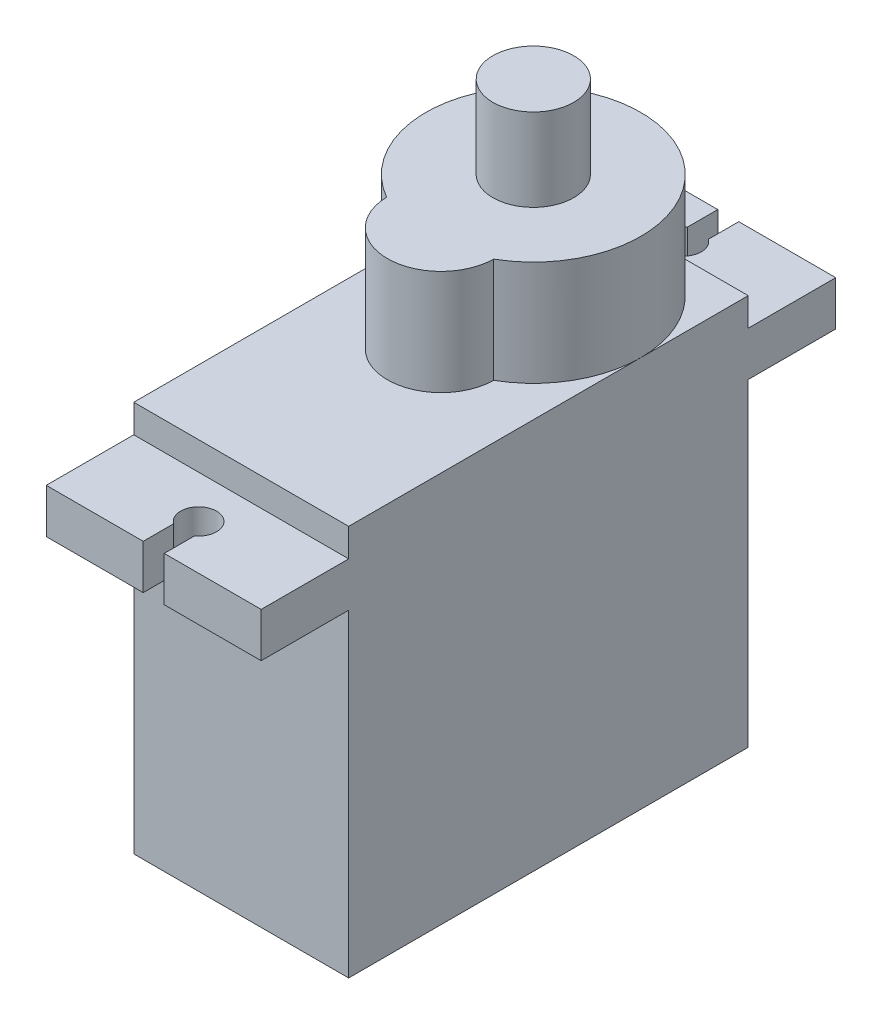
ISO-10303-21;
HEADER;
FILE_DESCRIPTION(('STEP AP214'),'2;1');
FILE_NAME('part.step','',(''),(''),'','','');
FILE_SCHEMA(('AUTOMOTIVE_DESIGN { 1 0 10303 214 1 1 1 1 }'));
ENDSEC;
DATA;
#1=APPLICATION_CONTEXT('core data for automotive mechanical design processes');
#2=APPLICATION_PROTOCOL_DEFINITION('international standard','automotive_design',2000,#1);
#3=PRODUCT_CONTEXT('',#1,'mechanical');
#4=PRODUCT('Part','Part','',(#3));
#5=PRODUCT_RELATED_PRODUCT_CATEGORY('part','',(#4));
#6=PRODUCT_DEFINITION_FORMATION('','',#4);
#7=PRODUCT_DEFINITION_CONTEXT('part definition',#1,'design');
#8=PRODUCT_DEFINITION('design','',#6,#7);
#9=PRODUCT_DEFINITION_SHAPE('','',#8);
#10=(LENGTH_UNIT() NAMED_UNIT(*) SI_UNIT(.MILLI.,.METRE.));
#11=(NAMED_UNIT(*) PLANE_ANGLE_UNIT() SI_UNIT($,.RADIAN.));
#12=(NAMED_UNIT(*) SI_UNIT($,.STERADIAN.) SOLID_ANGLE_UNIT());
#13=UNCERTAINTY_MEASURE_WITH_UNIT(LENGTH_MEASURE(1.E-05),#10,'distance_accuracy_value','');
#14=(GEOMETRIC_REPRESENTATION_CONTEXT(3) GLOBAL_UNCERTAINTY_ASSIGNED_CONTEXT((#13)) GLOBAL_UNIT_ASSIGNED_CONTEXT((#10,
#11,#12)) REPRESENTATION_CONTEXT('',''));
#15=CARTESIAN_POINT('',(0.,0.,0.));
#16=DIRECTION('',(0.,0.,1.));
#17=DIRECTION('',(1.,0.,0.));
#18=AXIS2_PLACEMENT_3D('',#15,#16,#17);
#19=CARTESIAN_POINT('',(0.,28.35,-2.6375));
#20=DIRECTION('',(0.,1.,0.));
#21=DIRECTION('',(0.,0.,1.));
#22=AXIS2_PLACEMENT_3D('',#19,#20,#21);
#23=PLANE('',#22);
#24=CARTESIAN_POINT('',(0.,28.35,-5.275));
#25=DIRECTION('',(0.,1.,0.));
#26=DIRECTION('',(0.,0.,1.));
#27=AXIS2_PLACEMENT_3D('',#24,#25,#26);
#28=CIRCLE('',#27,2.31);
#29=CARTESIAN_POINT('',(0.,28.35,-2.96499999999999));
#30=VERTEX_POINT('',#29);
#31=EDGE_CURVE('E53',#30,#30,#28,.F.);
#32=ORIENTED_EDGE('',*,*,#31,.T.);
#33=EDGE_LOOP('',(#32));
#34=FACE_BOUND('',#33,.T.);
#35=ADVANCED_FACE('F49',(#34),#23,.F.);
#36=CARTESIAN_POINT('',(0.,-0.002000000000002,-5.275));
#37=DIRECTION('',(0.,1.,0.));
#38=DIRECTION('',(0.,0.,1.));
#39=AXIS2_PLACEMENT_3D('',#36,#37,#38);
#40=CYLINDRICAL_SURFACE('',#39,2.31);
#41=ORIENTED_EDGE('',*,*,#31,.F.);
#42=EDGE_LOOP('',(#41));
#43=FACE_BOUND('',#42,.T.);
#44=CARTESIAN_POINT('',(0.,33.07,-5.275));
#45=DIRECTION('',(0.,1.,0.));
#46=DIRECTION('',(0.,0.,1.));
#47=AXIS2_PLACEMENT_3D('',#44,#45,#46);
#48=CIRCLE('',#47,2.31);
#49=CARTESIAN_POINT('',(0.,33.07,-2.96499999999999));
#50=VERTEX_POINT('',#49);
#51=EDGE_CURVE('E11',#50,#50,#48,.T.);
#52=ORIENTED_EDGE('',*,*,#51,.F.);
#53=EDGE_LOOP('',(#52));
#54=FACE_BOUND('',#53,.T.);
#55=ADVANCED_FACE('F51',(#43,#54),#40,.T.);
#56=CARTESIAN_POINT('',(0.,33.07,-5.275));
#57=DIRECTION('',(0.,1.,0.));
#58=DIRECTION('',(0.,0.,1.));
#59=AXIS2_PLACEMENT_3D('',#56,#57,#58);
#60=PLANE('',#59);
#61=ORIENTED_EDGE('',*,*,#51,.T.);
#62=EDGE_LOOP('',(#61));
#63=FACE_BOUND('',#62,.T.);
#64=ADVANCED_FACE('F67',(#63),#60,.T.);
#65=CLOSED_SHELL('',(#35,#55,#64));
#66=MANIFOLD_SOLID_BREP('B2',#65);
#67=CARTESIAN_POINT('',(0.,22.35,0.));
#68=DIRECTION('',(0.,1.,0.));
#69=DIRECTION('',(0.,0.,1.));
#70=AXIS2_PLACEMENT_3D('',#67,#68,#69);
#71=PLANE('',#70);
#72=CARTESIAN_POINT('',(0.,22.35,-5.275));
#73=DIRECTION('',(0.,1.,0.));
#74=DIRECTION('',(0.,0.,1.));
#75=AXIS2_PLACEMENT_3D('',#72,#73,#74);
#76=CIRCLE('',#75,6.14);
#77=CARTESIAN_POINT('',(3.05961757208688,22.35,0.0483767772511922));
#78=VERTEX_POINT('',#77);
#79=CARTESIAN_POINT('',(6.14,22.35,-5.275));
#80=VERTEX_POINT('',#79);
#81=EDGE_CURVE('E104',#78,#80,#76,.T.);
#82=ORIENTED_EDGE('',*,*,#81,.F.);
#83=CARTESIAN_POINT('',(0.,22.35,0.));
#84=DIRECTION('',(0.,1.,0.));
#85=DIRECTION('',(0.,0.,1.));
#86=AXIS2_PLACEMENT_3D('',#83,#84,#85);
#87=CIRCLE('',#86,3.06);
#88=CARTESIAN_POINT('',(-3.05961757208688,22.35,0.0483767772511887));
#89=VERTEX_POINT('',#88);
#90=EDGE_CURVE('E111',#89,#78,#87,.T.);
#91=ORIENTED_EDGE('',*,*,#90,.F.);
#92=CARTESIAN_POINT('',(-6.14,22.35,-5.27499999999999));
#93=VERTEX_POINT('',#92);
#94=EDGE_CURVE('E115',#93,#89,#76,.T.);
#95=ORIENTED_EDGE('',*,*,#94,.F.);
#96=DIRECTION('',(0.,0.,1.));
#97=VECTOR('',#96,1.);
#98=CARTESIAN_POINT('',(-6.14,22.35,-11.415));
#99=LINE('',#98,#97);
#100=CARTESIAN_POINT('',(-6.14,22.35,11.415));
#101=VERTEX_POINT('',#100);
#102=EDGE_CURVE('E449',#93,#101,#99,.T.);
#103=ORIENTED_EDGE('',*,*,#102,.T.);
#104=DIRECTION('',(1.,0.,0.));
#105=VECTOR('',#104,1.);
#106=CARTESIAN_POINT('',(-6.14,22.35,11.415));
#107=LINE('',#106,#105);
#108=CARTESIAN_POINT('',(6.14,22.35,11.415));
#109=VERTEX_POINT('',#108);
#110=EDGE_CURVE('E454',#101,#109,#107,.T.);
#111=ORIENTED_EDGE('',*,*,#110,.T.);
#112=DIRECTION('',(0.,0.,-1.));
#113=VECTOR('',#112,1.);
#114=CARTESIAN_POINT('',(6.14,22.35,-11.415));
#115=LINE('',#114,#113);
#116=EDGE_CURVE('E439',#109,#80,#115,.T.);
#117=ORIENTED_EDGE('',*,*,#116,.T.);
#118=EDGE_LOOP('',(#82,#91,#95,#103,#111,#117));
#119=FACE_BOUND('',#118,.T.);
#120=ADVANCED_FACE('F92',(#119),#71,.T.);
#121=CARTESIAN_POINT('',(0.,22.35,-11.415));
#122=VERTEX_POINT('',#121);
#123=EDGE_CURVE('E47',#80,#122,#76,.T.);
#124=ORIENTED_EDGE('',*,*,#123,.F.);
#125=CARTESIAN_POINT('',(6.14,22.35,-11.415));
#126=VERTEX_POINT('',#125);
#127=EDGE_CURVE('E444',#80,#126,#115,.T.);
#128=ORIENTED_EDGE('',*,*,#127,.T.);
#129=DIRECTION('',(-1.,0.,0.));
#130=VECTOR('',#129,1.);
#131=CARTESIAN_POINT('',(-6.14,22.35,-11.415));
#132=LINE('',#131,#130);
#133=EDGE_CURVE('E445',#126,#122,#132,.T.);
#134=ORIENTED_EDGE('',*,*,#133,.T.);
#135=EDGE_LOOP('',(#124,#128,#134));
#136=FACE_BOUND('',#135,.T.);
#137=ADVANCED_FACE('F517',(#136),#71,.T.);
#138=CARTESIAN_POINT('',(-6.14,22.35,-11.415));
#139=DIRECTION('',(0.,0.,1.));
#140=DIRECTION('',(1.,0.,0.));
#141=AXIS2_PLACEMENT_3D('',#138,#139,#140);
#142=PLANE('',#141);
#143=DIRECTION('',(-1.,0.,0.));
#144=VECTOR('',#143,1.);
#145=CARTESIAN_POINT('',(-6.14,18.2,-11.415));
#146=LINE('',#145,#144);
#147=CARTESIAN_POINT('',(6.14,18.2,-11.415));
#148=VERTEX_POINT('',#147);
#149=CARTESIAN_POINT('',(-6.14,18.2,-11.415));
#150=VERTEX_POINT('',#149);
#151=EDGE_CURVE('E272',#148,#150,#146,.T.);
#152=ORIENTED_EDGE('',*,*,#151,.F.);
#153=DIRECTION('',(0.,-1.,0.));
#154=VECTOR('',#153,1.);
#155=CARTESIAN_POINT('',(6.14,22.35,-11.415));
#156=LINE('',#155,#154);
#157=CARTESIAN_POINT('',(6.14,0.,-11.415));
#158=VERTEX_POINT('',#157);
#159=EDGE_CURVE('E485',#148,#158,#156,.T.);
#160=ORIENTED_EDGE('',*,*,#159,.T.);
#161=DIRECTION('',(-1.,0.,0.));
#162=VECTOR('',#161,1.);
#163=CARTESIAN_POINT('',(-6.14,0.,-11.415));
#164=LINE('',#163,#162);
#165=CARTESIAN_POINT('',(-6.14,0.,-11.415));
#166=VERTEX_POINT('',#165);
#167=EDGE_CURVE('E461',#158,#166,#164,.T.);
#168=ORIENTED_EDGE('',*,*,#167,.T.);
#169=DIRECTION('',(0.,-1.,0.));
#170=VECTOR('',#169,1.);
#171=CARTESIAN_POINT('',(-6.14,22.35,-11.415));
#172=LINE('',#171,#170);
#173=EDGE_CURVE('E481',#150,#166,#172,.T.);
#174=ORIENTED_EDGE('',*,*,#173,.F.);
#175=EDGE_LOOP('',(#152,#160,#168,#174));
#176=FACE_BOUND('',#175,.T.);
#177=ADVANCED_FACE('F499',(#176),#142,.F.);
#178=CARTESIAN_POINT('',(-6.14,22.35,11.415));
#179=DIRECTION('',(0.,0.,-1.));
#180=DIRECTION('',(-1.,0.,0.));
#181=AXIS2_PLACEMENT_3D('',#178,#179,#180);
#182=PLANE('',#181);
#183=DIRECTION('',(1.,0.,0.));
#184=VECTOR('',#183,1.);
#185=CARTESIAN_POINT('',(6.14,18.2,11.415));
#186=LINE('',#185,#184);
#187=CARTESIAN_POINT('',(-6.14,18.2,11.415));
#188=VERTEX_POINT('',#187);
#189=CARTESIAN_POINT('',(6.14,18.2,11.415));
#190=VERTEX_POINT('',#189);
#191=EDGE_CURVE('E364',#188,#190,#186,.T.);
#192=ORIENTED_EDGE('',*,*,#191,.F.);
#193=DIRECTION('',(0.,-1.,0.));
#194=VECTOR('',#193,1.);
#195=CARTESIAN_POINT('',(-6.14,22.35,11.415));
#196=LINE('',#195,#194);
#197=CARTESIAN_POINT('',(-6.14,0.,11.415));
#198=VERTEX_POINT('',#197);
#199=EDGE_CURVE('E477',#188,#198,#196,.T.);
#200=ORIENTED_EDGE('',*,*,#199,.T.);
#201=DIRECTION('',(1.,0.,0.));
#202=VECTOR('',#201,1.);
#203=CARTESIAN_POINT('',(-6.14,0.,11.415));
#204=LINE('',#203,#202);
#205=CARTESIAN_POINT('',(6.14,0.,11.415));
#206=VERTEX_POINT('',#205);
#207=EDGE_CURVE('E469',#198,#206,#204,.T.);
#208=ORIENTED_EDGE('',*,*,#207,.T.);
#209=DIRECTION('',(0.,-1.,0.));
#210=VECTOR('',#209,1.);
#211=CARTESIAN_POINT('',(6.14,22.35,11.415));
#212=LINE('',#211,#210);
#213=EDGE_CURVE('E457',#190,#206,#212,.T.);
#214=ORIENTED_EDGE('',*,*,#213,.F.);
#215=EDGE_LOOP('',(#192,#200,#208,#214));
#216=FACE_BOUND('',#215,.T.);
#217=ADVANCED_FACE('F507',(#216),#182,.F.);
#218=CARTESIAN_POINT('',(6.14,22.35,-11.415));
#219=DIRECTION('',(-1.,0.,0.));
#220=DIRECTION('',(0.,0.,1.));
#221=AXIS2_PLACEMENT_3D('',#218,#219,#220);
#222=PLANE('',#221);
#223=DIRECTION('',(0.,0.,-1.));
#224=VECTOR('',#223,1.);
#225=CARTESIAN_POINT('',(6.14,0.,-11.415));
#226=LINE('',#225,#224);
#227=EDGE_CURVE('E424',#206,#158,#226,.T.);
#228=ORIENTED_EDGE('',*,*,#227,.T.);
#229=ORIENTED_EDGE('',*,*,#159,.F.);
#230=DIRECTION('',(0.,0.,1.));
#231=VECTOR('',#230,1.);
#232=CARTESIAN_POINT('',(6.14000000000001,18.2,-16.415));
#233=LINE('',#232,#231);
#234=CARTESIAN_POINT('',(6.14000000000001,18.2,-16.415));
#235=VERTEX_POINT('',#234);
#236=EDGE_CURVE('E287',#235,#148,#233,.T.);
#237=ORIENTED_EDGE('',*,*,#236,.F.);
#238=DIRECTION('',(0.,-1.,0.));
#239=VECTOR('',#238,1.);
#240=CARTESIAN_POINT('',(6.14000000000001,20.74,-16.415));
#241=LINE('',#240,#239);
#242=CARTESIAN_POINT('',(6.14000000000001,20.74,-16.415));
#243=VERTEX_POINT('',#242);
#244=EDGE_CURVE('E341',#243,#235,#241,.T.);
#245=ORIENTED_EDGE('',*,*,#244,.F.);
#246=DIRECTION('',(0.,0.,1.));
#247=VECTOR('',#246,1.);
#248=CARTESIAN_POINT('',(6.14000000000001,20.74,-16.415));
#249=LINE('',#248,#247);
#250=CARTESIAN_POINT('',(6.14,20.74,-11.415));
#251=VERTEX_POINT('',#250);
#252=EDGE_CURVE('E311',#243,#251,#249,.T.);
#253=ORIENTED_EDGE('',*,*,#252,.T.);
#254=EDGE_CURVE('E96',#126,#251,#156,.T.);
#255=ORIENTED_EDGE('',*,*,#254,.F.);
#256=ORIENTED_EDGE('',*,*,#127,.F.);
#257=ORIENTED_EDGE('',*,*,#116,.F.);
#258=CARTESIAN_POINT('',(6.14,20.74,11.415));
#259=VERTEX_POINT('',#258);
#260=EDGE_CURVE('E473',#109,#259,#212,.T.);
#261=ORIENTED_EDGE('',*,*,#260,.T.);
#262=DIRECTION('',(0.,0.,1.));
#263=VECTOR('',#262,1.);
#264=CARTESIAN_POINT('',(6.14,20.74,16.415));
#265=LINE('',#264,#263);
#266=CARTESIAN_POINT('',(6.14,20.74,16.415));
#267=VERTEX_POINT('',#266);
#268=EDGE_CURVE('E359',#259,#267,#265,.T.);
#269=ORIENTED_EDGE('',*,*,#268,.T.);
#270=DIRECTION('',(0.,-1.,0.));
#271=VECTOR('',#270,1.);
#272=CARTESIAN_POINT('',(6.14,20.74,16.415));
#273=LINE('',#272,#271);
#274=CARTESIAN_POINT('',(6.14,18.2,16.415));
#275=VERTEX_POINT('',#274);
#276=EDGE_CURVE('E391',#267,#275,#273,.T.);
#277=ORIENTED_EDGE('',*,*,#276,.T.);
#278=DIRECTION('',(0.,0.,1.));
#279=VECTOR('',#278,1.);
#280=CARTESIAN_POINT('',(6.14,18.2,16.415));
#281=LINE('',#280,#279);
#282=EDGE_CURVE('E344',#190,#275,#281,.T.);
#283=ORIENTED_EDGE('',*,*,#282,.F.);
#284=ORIENTED_EDGE('',*,*,#213,.T.);
#285=EDGE_LOOP('',(#228,#229,#237,#245,#253,#255,#256,#257,#261,#269,#277,#283,#284));
#286=FACE_BOUND('',#285,.T.);
#287=ADVANCED_FACE('F94',(#286),#222,.F.);
#288=ORIENTED_EDGE('',*,*,#254,.T.);
#289=DIRECTION('',(-1.,0.,0.));
#290=VECTOR('',#289,1.);
#291=CARTESIAN_POINT('',(-6.14,20.74,-11.415));
#292=LINE('',#291,#290);
#293=CARTESIAN_POINT('',(-6.14,20.74,-11.415));
#294=VERTEX_POINT('',#293);
#295=EDGE_CURVE('E282',#251,#294,#292,.T.);
#296=ORIENTED_EDGE('',*,*,#295,.T.);
#297=CARTESIAN_POINT('',(-6.14,22.35,-11.415));
#298=VERTEX_POINT('',#297);
#299=EDGE_CURVE('E482',#298,#294,#172,.T.);
#300=ORIENTED_EDGE('',*,*,#299,.F.);
#301=EDGE_CURVE('E443',#122,#298,#132,.T.);
#302=ORIENTED_EDGE('',*,*,#301,.F.);
#303=ORIENTED_EDGE('',*,*,#133,.F.);
#304=EDGE_LOOP('',(#288,#296,#300,#302,#303));
#305=FACE_BOUND('',#304,.T.);
#306=ADVANCED_FACE('F524',(#305),#142,.F.);
#307=CARTESIAN_POINT('',(-6.14,22.35,-11.415));
#308=DIRECTION('',(1.,0.,0.));
#309=DIRECTION('',(0.,0.,-1.));
#310=AXIS2_PLACEMENT_3D('',#307,#308,#309);
#311=PLANE('',#310);
#312=DIRECTION('',(0.,0.,1.));
#313=VECTOR('',#312,1.);
#314=CARTESIAN_POINT('',(-6.14,0.,-11.415));
#315=LINE('',#314,#313);
#316=EDGE_CURVE('E465',#166,#198,#315,.T.);
#317=ORIENTED_EDGE('',*,*,#316,.T.);
#318=ORIENTED_EDGE('',*,*,#199,.F.);
#319=DIRECTION('',(0.,0.,-1.));
#320=VECTOR('',#319,1.);
#321=CARTESIAN_POINT('',(-6.14,18.2,11.415));
#322=LINE('',#321,#320);
#323=CARTESIAN_POINT('',(-6.14,18.2,16.415));
#324=VERTEX_POINT('',#323);
#325=EDGE_CURVE('E415',#324,#188,#322,.T.);
#326=ORIENTED_EDGE('',*,*,#325,.F.);
#327=DIRECTION('',(0.,-1.,0.));
#328=VECTOR('',#327,1.);
#329=CARTESIAN_POINT('',(-6.14,20.74,16.415));
#330=LINE('',#329,#328);
#331=CARTESIAN_POINT('',(-6.14,20.74,16.415));
#332=VERTEX_POINT('',#331);
#333=EDGE_CURVE('E421',#332,#324,#330,.T.);
#334=ORIENTED_EDGE('',*,*,#333,.F.);
#335=DIRECTION('',(0.,0.,-1.));
#336=VECTOR('',#335,1.);
#337=CARTESIAN_POINT('',(-6.14,20.74,11.415));
#338=LINE('',#337,#336);
#339=CARTESIAN_POINT('',(-6.14,20.74,11.415));
#340=VERTEX_POINT('',#339);
#341=EDGE_CURVE('E384',#332,#340,#338,.T.);
#342=ORIENTED_EDGE('',*,*,#341,.T.);
#343=EDGE_CURVE('E478',#101,#340,#196,.T.);
#344=ORIENTED_EDGE('',*,*,#343,.F.);
#345=ORIENTED_EDGE('',*,*,#102,.F.);
#346=EDGE_CURVE('E450',#298,#93,#99,.T.);
#347=ORIENTED_EDGE('',*,*,#346,.F.);
#348=ORIENTED_EDGE('',*,*,#299,.T.);
#349=DIRECTION('',(0.,0.,-1.));
#350=VECTOR('',#349,1.);
#351=CARTESIAN_POINT('',(-6.14,20.74,-11.415));
#352=LINE('',#351,#350);
#353=CARTESIAN_POINT('',(-6.14,20.74,-16.415));
#354=VERTEX_POINT('',#353);
#355=EDGE_CURVE('E286',#294,#354,#352,.T.);
#356=ORIENTED_EDGE('',*,*,#355,.T.);
#357=DIRECTION('',(0.,-1.,0.));
#358=VECTOR('',#357,1.);
#359=CARTESIAN_POINT('',(-6.14,20.74,-16.415));
#360=LINE('',#359,#358);
#361=CARTESIAN_POINT('',(-6.14,18.2,-16.415));
#362=VERTEX_POINT('',#361);
#363=EDGE_CURVE('E314',#354,#362,#360,.T.);
#364=ORIENTED_EDGE('',*,*,#363,.T.);
#365=DIRECTION('',(0.,0.,-1.));
#366=VECTOR('',#365,1.);
#367=CARTESIAN_POINT('',(-6.14,18.2,-11.415));
#368=LINE('',#367,#366);
#369=EDGE_CURVE('E277',#150,#362,#368,.T.);
#370=ORIENTED_EDGE('',*,*,#369,.F.);
#371=ORIENTED_EDGE('',*,*,#173,.T.);
#372=EDGE_LOOP('',(#317,#318,#326,#334,#342,#344,#345,#347,#348,#356,#364,#370,#371));
#373=FACE_BOUND('',#372,.T.);
#374=ADVANCED_FACE('F492',(#373),#311,.F.);
#375=ORIENTED_EDGE('',*,*,#343,.T.);
#376=DIRECTION('',(1.,0.,0.));
#377=VECTOR('',#376,1.);
#378=CARTESIAN_POINT('',(6.14,20.74,11.415));
#379=LINE('',#378,#377);
#380=EDGE_CURVE('E387',#340,#259,#379,.T.);
#381=ORIENTED_EDGE('',*,*,#380,.T.);
#382=ORIENTED_EDGE('',*,*,#260,.F.);
#383=ORIENTED_EDGE('',*,*,#110,.F.);
#384=EDGE_LOOP('',(#375,#381,#382,#383));
#385=FACE_BOUND('',#384,.T.);
#386=ADVANCED_FACE('F534',(#385),#182,.F.);
#387=EDGE_CURVE('E102',#122,#93,#76,.T.);
#388=ORIENTED_EDGE('',*,*,#387,.F.);
#389=ORIENTED_EDGE('',*,*,#301,.T.);
#390=ORIENTED_EDGE('',*,*,#346,.T.);
#391=EDGE_LOOP('',(#388,#389,#390));
#392=FACE_BOUND('',#391,.T.);
#393=ADVANCED_FACE('F572',(#392),#71,.T.);
#394=CARTESIAN_POINT('',(0.,0.,0.));
#395=DIRECTION('',(0.,1.,0.));
#396=DIRECTION('',(0.,0.,1.));
#397=AXIS2_PLACEMENT_3D('',#394,#395,#396);
#398=PLANE('',#397);
#399=ORIENTED_EDGE('',*,*,#227,.F.);
#400=ORIENTED_EDGE('',*,*,#207,.F.);
#401=ORIENTED_EDGE('',*,*,#316,.F.);
#402=ORIENTED_EDGE('',*,*,#167,.F.);
#403=EDGE_LOOP('',(#399,#400,#401,#402));
#404=FACE_BOUND('',#403,.T.);
#405=ADVANCED_FACE('F503',(#404),#398,.F.);
#406=CARTESIAN_POINT('',(-6.14,20.74,16.415));
#407=DIRECTION('',(0.,0.,1.));
#408=DIRECTION('',(1.,0.,0.));
#409=AXIS2_PLACEMENT_3D('',#406,#407,#408);
#410=PLANE('',#409);
#411=DIRECTION('',(-1.,0.,0.));
#412=VECTOR('',#411,1.);
#413=CARTESIAN_POINT('',(-6.14,18.2,16.415));
#414=LINE('',#413,#412);
#415=CARTESIAN_POINT('',(-0.6,18.2,16.415));
#416=VERTEX_POINT('',#415);
#417=EDGE_CURVE('E411',#416,#324,#414,.T.);
#418=ORIENTED_EDGE('',*,*,#417,.F.);
#419=DIRECTION('',(0.,-1.,0.));
#420=VECTOR('',#419,1.);
#421=CARTESIAN_POINT('',(-0.6,20.74,16.415));
#422=LINE('',#421,#420);
#423=CARTESIAN_POINT('',(-0.6,20.74,16.415));
#424=VERTEX_POINT('',#423);
#425=EDGE_CURVE('E425',#424,#416,#422,.T.);
#426=ORIENTED_EDGE('',*,*,#425,.F.);
#427=DIRECTION('',(-1.,0.,0.));
#428=VECTOR('',#427,1.);
#429=CARTESIAN_POINT('',(-6.14,20.74,16.415));
#430=LINE('',#429,#428);
#431=EDGE_CURVE('E380',#424,#332,#430,.T.);
#432=ORIENTED_EDGE('',*,*,#431,.T.);
#433=ORIENTED_EDGE('',*,*,#333,.T.);
#434=EDGE_LOOP('',(#418,#426,#432,#433));
#435=FACE_BOUND('',#434,.T.);
#436=ADVANCED_FACE('F552',(#435),#410,.T.);
#437=CARTESIAN_POINT('',(-0.6,20.74,14.6810385069297));
#438=DIRECTION('',(1.,0.,0.));
#439=DIRECTION('',(0.,0.,-1.));
#440=AXIS2_PLACEMENT_3D('',#437,#438,#439);
#441=PLANE('',#440);
#442=DIRECTION('',(0.,0.,1.));
#443=VECTOR('',#442,1.);
#444=CARTESIAN_POINT('',(-0.6,18.2,14.6810385069297));
#445=LINE('',#444,#443);
#446=CARTESIAN_POINT('',(-0.6,18.2,14.6810385069297));
#447=VERTEX_POINT('',#446);
#448=EDGE_CURVE('E407',#447,#416,#445,.T.);
#449=ORIENTED_EDGE('',*,*,#448,.F.);
#450=DIRECTION('',(0.,-1.,0.));
#451=VECTOR('',#450,1.);
#452=CARTESIAN_POINT('',(-0.6,20.74,14.6810385069297));
#453=LINE('',#452,#451);
#454=CARTESIAN_POINT('',(-0.6,20.74,14.6810385069297));
#455=VERTEX_POINT('',#454);
#456=EDGE_CURVE('E428',#455,#447,#453,.T.);
#457=ORIENTED_EDGE('',*,*,#456,.F.);
#458=DIRECTION('',(0.,0.,1.));
#459=VECTOR('',#458,1.);
#460=CARTESIAN_POINT('',(-0.6,20.74,14.6810385069297));
#461=LINE('',#460,#459);
#462=EDGE_CURVE('E376',#455,#424,#461,.T.);
#463=ORIENTED_EDGE('',*,*,#462,.T.);
#464=ORIENTED_EDGE('',*,*,#425,.T.);
#465=EDGE_LOOP('',(#449,#457,#463,#464));
#466=FACE_BOUND('',#465,.T.);
#467=ADVANCED_FACE('F556',(#466),#441,.T.);
#468=CARTESIAN_POINT('',(0.,20.74,13.85));
#469=DIRECTION('',(0.,-1.,0.));
#470=DIRECTION('',(0.,0.,-1.));
#471=AXIS2_PLACEMENT_3D('',#468,#469,#470);
#472=CYLINDRICAL_SURFACE('',#471,1.025);
#473=CARTESIAN_POINT('',(0.,18.2,13.85));
#474=DIRECTION('',(0.,1.,0.));
#475=DIRECTION('',(0.,0.,-1.));
#476=AXIS2_PLACEMENT_3D('',#473,#474,#475);
#477=CIRCLE('',#476,1.025);
#478=CARTESIAN_POINT('',(0.6,18.2,14.6810385069297));
#479=VERTEX_POINT('',#478);
#480=EDGE_CURVE('E403',#479,#447,#477,.T.);
#481=ORIENTED_EDGE('',*,*,#480,.F.);
#482=DIRECTION('',(0.,-1.,0.));
#483=VECTOR('',#482,1.);
#484=CARTESIAN_POINT('',(0.6,20.74,14.6810385069297));
#485=LINE('',#484,#483);
#486=CARTESIAN_POINT('',(0.6,20.74,14.6810385069297));
#487=VERTEX_POINT('',#486);
#488=EDGE_CURVE('E431',#487,#479,#485,.T.);
#489=ORIENTED_EDGE('',*,*,#488,.F.);
#490=CARTESIAN_POINT('',(0.,20.74,13.85));
#491=DIRECTION('',(0.,1.,0.));
#492=DIRECTION('',(0.,0.,-1.));
#493=AXIS2_PLACEMENT_3D('',#490,#491,#492);
#494=CIRCLE('',#493,1.025);
#495=EDGE_CURVE('E372',#487,#455,#494,.T.);
#496=ORIENTED_EDGE('',*,*,#495,.T.);
#497=ORIENTED_EDGE('',*,*,#456,.T.);
#498=EDGE_LOOP('',(#481,#489,#496,#497));
#499=FACE_BOUND('',#498,.T.);
#500=ADVANCED_FACE('F559',(#499),#472,.F.);
#501=CARTESIAN_POINT('',(0.6,20.74,14.6810385069297));
#502=DIRECTION('',(-1.,0.,0.));
#503=DIRECTION('',(0.,0.,1.));
#504=AXIS2_PLACEMENT_3D('',#501,#502,#503);
#505=PLANE('',#504);
#506=DIRECTION('',(0.,0.,-1.));
#507=VECTOR('',#506,1.);
#508=CARTESIAN_POINT('',(0.6,18.2,14.6810385069297));
#509=LINE('',#508,#507);
#510=CARTESIAN_POINT('',(0.6,18.2,16.415));
#511=VERTEX_POINT('',#510);
#512=EDGE_CURVE('E399',#511,#479,#509,.T.);
#513=ORIENTED_EDGE('',*,*,#512,.F.);
#514=DIRECTION('',(0.,-1.,0.));
#515=VECTOR('',#514,1.);
#516=CARTESIAN_POINT('',(0.6,20.74,16.415));
#517=LINE('',#516,#515);
#518=CARTESIAN_POINT('',(0.6,20.74,16.415));
#519=VERTEX_POINT('',#518);
#520=EDGE_CURVE('E434',#519,#511,#517,.T.);
#521=ORIENTED_EDGE('',*,*,#520,.F.);
#522=DIRECTION('',(0.,0.,-1.));
#523=VECTOR('',#522,1.);
#524=CARTESIAN_POINT('',(0.6,20.74,14.6810385069297));
#525=LINE('',#524,#523);
#526=EDGE_CURVE('E368',#519,#487,#525,.T.);
#527=ORIENTED_EDGE('',*,*,#526,.T.);
#528=ORIENTED_EDGE('',*,*,#488,.T.);
#529=EDGE_LOOP('',(#513,#521,#527,#528));
#530=FACE_BOUND('',#529,.T.);
#531=ADVANCED_FACE('F561',(#530),#505,.T.);
#532=CARTESIAN_POINT('',(0.6,20.74,16.415));
#533=DIRECTION('',(0.,0.,1.));
#534=DIRECTION('',(1.,0.,0.));
#535=AXIS2_PLACEMENT_3D('',#532,#533,#534);
#536=PLANE('',#535);
#537=DIRECTION('',(-1.,0.,0.));
#538=VECTOR('',#537,1.);
#539=CARTESIAN_POINT('',(0.6,18.2,16.415));
#540=LINE('',#539,#538);
#541=EDGE_CURVE('E395',#275,#511,#540,.T.);
#542=ORIENTED_EDGE('',*,*,#541,.F.);
#543=ORIENTED_EDGE('',*,*,#276,.F.);
#544=DIRECTION('',(-1.,0.,0.));
#545=VECTOR('',#544,1.);
#546=CARTESIAN_POINT('',(0.6,20.74,16.415));
#547=LINE('',#546,#545);
#548=EDGE_CURVE('E363',#267,#519,#547,.T.);
#549=ORIENTED_EDGE('',*,*,#548,.T.);
#550=ORIENTED_EDGE('',*,*,#520,.T.);
#551=EDGE_LOOP('',(#542,#543,#549,#550));
#552=FACE_BOUND('',#551,.T.);
#553=ADVANCED_FACE('F546',(#552),#536,.T.);
#554=CARTESIAN_POINT('',(0.,20.74,13.85));
#555=DIRECTION('',(0.,-1.,0.));
#556=DIRECTION('',(0.,0.,-1.));
#557=AXIS2_PLACEMENT_3D('',#554,#555,#556);
#558=PLANE('',#557);
#559=ORIENTED_EDGE('',*,*,#268,.F.);
#560=ORIENTED_EDGE('',*,*,#380,.F.);
#561=ORIENTED_EDGE('',*,*,#341,.F.);
#562=ORIENTED_EDGE('',*,*,#431,.F.);
#563=ORIENTED_EDGE('',*,*,#462,.F.);
#564=ORIENTED_EDGE('',*,*,#495,.F.);
#565=ORIENTED_EDGE('',*,*,#526,.F.);
#566=ORIENTED_EDGE('',*,*,#548,.F.);
#567=EDGE_LOOP('',(#559,#560,#561,#562,#563,#564,#565,#566));
#568=FACE_BOUND('',#567,.T.);
#569=ADVANCED_FACE('F539',(#568),#558,.F.);
#570=CARTESIAN_POINT('',(0.,18.2,13.85));
#571=DIRECTION('',(0.,-1.,0.));
#572=DIRECTION('',(0.,0.,-1.));
#573=AXIS2_PLACEMENT_3D('',#570,#571,#572);
#574=PLANE('',#573);
#575=ORIENTED_EDGE('',*,*,#282,.T.);
#576=ORIENTED_EDGE('',*,*,#541,.T.);
#577=ORIENTED_EDGE('',*,*,#512,.T.);
#578=ORIENTED_EDGE('',*,*,#480,.T.);
#579=ORIENTED_EDGE('',*,*,#448,.T.);
#580=ORIENTED_EDGE('',*,*,#417,.T.);
#581=ORIENTED_EDGE('',*,*,#325,.T.);
#582=ORIENTED_EDGE('',*,*,#191,.T.);
#583=EDGE_LOOP('',(#575,#576,#577,#578,#579,#580,#581,#582));
#584=FACE_BOUND('',#583,.T.);
#585=ADVANCED_FACE('F549',(#584),#574,.T.);
#586=CARTESIAN_POINT('',(0.600000000000005,20.74,-16.415));
#587=DIRECTION('',(0.,0.,-1.));
#588=DIRECTION('',(-1.,0.,0.));
#589=AXIS2_PLACEMENT_3D('',#586,#587,#588);
#590=PLANE('',#589);
#591=DIRECTION('',(1.,0.,0.));
#592=VECTOR('',#591,1.);
#593=CARTESIAN_POINT('',(0.600000000000005,18.2,-16.415));
#594=LINE('',#593,#592);
#595=CARTESIAN_POINT('',(0.600000000000005,18.2,-16.415));
#596=VERTEX_POINT('',#595);
#597=EDGE_CURVE('E335',#596,#235,#594,.T.);
#598=ORIENTED_EDGE('',*,*,#597,.F.);
#599=DIRECTION('',(0.,-1.,0.));
#600=VECTOR('',#599,1.);
#601=CARTESIAN_POINT('',(0.600000000000005,20.74,-16.415));
#602=LINE('',#601,#600);
#603=CARTESIAN_POINT('',(0.600000000000005,20.74,-16.415));
#604=VERTEX_POINT('',#603);
#605=EDGE_CURVE('E345',#604,#596,#602,.T.);
#606=ORIENTED_EDGE('',*,*,#605,.F.);
#607=DIRECTION('',(1.,0.,0.));
#608=VECTOR('',#607,1.);
#609=CARTESIAN_POINT('',(0.600000000000005,20.74,-16.415));
#610=LINE('',#609,#608);
#611=EDGE_CURVE('E307',#604,#243,#610,.T.);
#612=ORIENTED_EDGE('',*,*,#611,.T.);
#613=ORIENTED_EDGE('',*,*,#244,.T.);
#614=EDGE_LOOP('',(#598,#606,#612,#613));
#615=FACE_BOUND('',#614,.T.);
#616=ADVANCED_FACE('F598',(#615),#590,.T.);
#617=CARTESIAN_POINT('',(0.600000000000005,20.74,-16.415));
#618=DIRECTION('',(-1.,0.,0.));
#619=DIRECTION('',(0.,0.,1.));
#620=AXIS2_PLACEMENT_3D('',#617,#618,#619);
#621=PLANE('',#620);
#622=DIRECTION('',(0.,0.,-1.));
#623=VECTOR('',#622,1.);
#624=CARTESIAN_POINT('',(0.600000000000005,18.2,-16.415));
#625=LINE('',#624,#623);
#626=CARTESIAN_POINT('',(0.600000000000004,18.2,-14.6810385069297));
#627=VERTEX_POINT('',#626);
#628=EDGE_CURVE('E331',#627,#596,#625,.T.);
#629=ORIENTED_EDGE('',*,*,#628,.F.);
#630=DIRECTION('',(0.,-1.,0.));
#631=VECTOR('',#630,1.);
#632=CARTESIAN_POINT('',(0.600000000000004,20.74,-14.6810385069297));
#633=LINE('',#632,#631);
#634=CARTESIAN_POINT('',(0.600000000000004,20.74,-14.6810385069297));
#635=VERTEX_POINT('',#634);
#636=EDGE_CURVE('E348',#635,#627,#633,.T.);
#637=ORIENTED_EDGE('',*,*,#636,.F.);
#638=DIRECTION('',(0.,0.,-1.));
#639=VECTOR('',#638,1.);
#640=CARTESIAN_POINT('',(0.600000000000005,20.74,-16.415));
#641=LINE('',#640,#639);
#642=EDGE_CURVE('E303',#635,#604,#641,.T.);
#643=ORIENTED_EDGE('',*,*,#642,.T.);
#644=ORIENTED_EDGE('',*,*,#605,.T.);
#645=EDGE_LOOP('',(#629,#637,#643,#644));
#646=FACE_BOUND('',#645,.T.);
#647=ADVANCED_FACE('F603',(#646),#621,.T.);
#648=CARTESIAN_POINT('',(0.,20.74,-13.85));
#649=DIRECTION('',(0.,-1.,0.));
#650=DIRECTION('',(0.,0.,-1.));
#651=AXIS2_PLACEMENT_3D('',#648,#649,#650);
#652=CYLINDRICAL_SURFACE('',#651,1.025);
#653=CARTESIAN_POINT('',(0.,18.2,-13.85));
#654=DIRECTION('',(0.,1.,0.));
#655=DIRECTION('',(0.,0.,-1.));
#656=AXIS2_PLACEMENT_3D('',#653,#654,#655);
#657=CIRCLE('',#656,1.025);
#658=CARTESIAN_POINT('',(-0.599999999999995,18.2,-14.6810385069297));
#659=VERTEX_POINT('',#658);
#660=EDGE_CURVE('E327',#659,#627,#657,.T.);
#661=ORIENTED_EDGE('',*,*,#660,.F.);
#662=DIRECTION('',(0.,-1.,0.));
#663=VECTOR('',#662,1.);
#664=CARTESIAN_POINT('',(-0.599999999999995,20.74,-14.6810385069297));
#665=LINE('',#664,#663);
#666=CARTESIAN_POINT('',(-0.599999999999995,20.74,-14.6810385069297));
#667=VERTEX_POINT('',#666);
#668=EDGE_CURVE('E351',#667,#659,#665,.T.);
#669=ORIENTED_EDGE('',*,*,#668,.F.);
#670=CARTESIAN_POINT('',(0.,20.74,-13.85));
#671=DIRECTION('',(0.,1.,0.));
#672=DIRECTION('',(0.,0.,-1.));
#673=AXIS2_PLACEMENT_3D('',#670,#671,#672);
#674=CIRCLE('',#673,1.025);
#675=EDGE_CURVE('E299',#667,#635,#674,.T.);
#676=ORIENTED_EDGE('',*,*,#675,.T.);
#677=ORIENTED_EDGE('',*,*,#636,.T.);
#678=EDGE_LOOP('',(#661,#669,#676,#677));
#679=FACE_BOUND('',#678,.T.);
#680=ADVANCED_FACE('F606',(#679),#652,.F.);
#681=CARTESIAN_POINT('',(-0.599999999999995,20.74,-16.415));
#682=DIRECTION('',(1.,0.,0.));
#683=DIRECTION('',(0.,0.,-1.));
#684=AXIS2_PLACEMENT_3D('',#681,#682,#683);
#685=PLANE('',#684);
#686=DIRECTION('',(0.,0.,1.));
#687=VECTOR('',#686,1.);
#688=CARTESIAN_POINT('',(-0.599999999999995,18.2,-16.415));
#689=LINE('',#688,#687);
#690=CARTESIAN_POINT('',(-0.599999999999995,18.2,-16.415));
#691=VERTEX_POINT('',#690);
#692=EDGE_CURVE('E323',#691,#659,#689,.T.);
#693=ORIENTED_EDGE('',*,*,#692,.F.);
#694=DIRECTION('',(0.,-1.,0.));
#695=VECTOR('',#694,1.);
#696=CARTESIAN_POINT('',(-0.599999999999995,20.74,-16.415));
#697=LINE('',#696,#695);
#698=CARTESIAN_POINT('',(-0.599999999999995,20.74,-16.415));
#699=VERTEX_POINT('',#698);
#700=EDGE_CURVE('E354',#699,#691,#697,.T.);
#701=ORIENTED_EDGE('',*,*,#700,.F.);
#702=DIRECTION('',(0.,0.,1.));
#703=VECTOR('',#702,1.);
#704=CARTESIAN_POINT('',(-0.599999999999995,20.74,-16.415));
#705=LINE('',#704,#703);
#706=EDGE_CURVE('E295',#699,#667,#705,.T.);
#707=ORIENTED_EDGE('',*,*,#706,.T.);
#708=ORIENTED_EDGE('',*,*,#668,.T.);
#709=EDGE_LOOP('',(#693,#701,#707,#708));
#710=FACE_BOUND('',#709,.T.);
#711=ADVANCED_FACE('F608',(#710),#685,.T.);
#712=CARTESIAN_POINT('',(-6.14,20.74,-16.415));
#713=DIRECTION('',(0.,0.,-1.));
#714=DIRECTION('',(-1.,0.,0.));
#715=AXIS2_PLACEMENT_3D('',#712,#713,#714);
#716=PLANE('',#715);
#717=DIRECTION('',(1.,0.,0.));
#718=VECTOR('',#717,1.);
#719=CARTESIAN_POINT('',(-6.14,18.2,-16.415));
#720=LINE('',#719,#718);
#721=EDGE_CURVE('E319',#362,#691,#720,.T.);
#722=ORIENTED_EDGE('',*,*,#721,.F.);
#723=ORIENTED_EDGE('',*,*,#363,.F.);
#724=DIRECTION('',(1.,0.,0.));
#725=VECTOR('',#724,1.);
#726=CARTESIAN_POINT('',(-6.14,20.74,-16.415));
#727=LINE('',#726,#725);
#728=EDGE_CURVE('E291',#354,#699,#727,.T.);
#729=ORIENTED_EDGE('',*,*,#728,.T.);
#730=ORIENTED_EDGE('',*,*,#700,.T.);
#731=EDGE_LOOP('',(#722,#723,#729,#730));
#732=FACE_BOUND('',#731,.T.);
#733=ADVANCED_FACE('F591',(#732),#716,.T.);
#734=CARTESIAN_POINT('',(0.,20.74,-13.85));
#735=DIRECTION('',(0.,-1.,0.));
#736=DIRECTION('',(0.,0.,-1.));
#737=AXIS2_PLACEMENT_3D('',#734,#735,#736);
#738=PLANE('',#737);
#739=ORIENTED_EDGE('',*,*,#295,.F.);
#740=ORIENTED_EDGE('',*,*,#252,.F.);
#741=ORIENTED_EDGE('',*,*,#611,.F.);
#742=ORIENTED_EDGE('',*,*,#642,.F.);
#743=ORIENTED_EDGE('',*,*,#675,.F.);
#744=ORIENTED_EDGE('',*,*,#706,.F.);
#745=ORIENTED_EDGE('',*,*,#728,.F.);
#746=ORIENTED_EDGE('',*,*,#355,.F.);
#747=EDGE_LOOP('',(#739,#740,#741,#742,#743,#744,#745,#746));
#748=FACE_BOUND('',#747,.T.);
#749=ADVANCED_FACE('F585',(#748),#738,.F.);
#750=CARTESIAN_POINT('',(0.,18.2,-13.85));
#751=DIRECTION('',(0.,-1.,0.));
#752=DIRECTION('',(0.,0.,-1.));
#753=AXIS2_PLACEMENT_3D('',#750,#751,#752);
#754=PLANE('',#753);
#755=ORIENTED_EDGE('',*,*,#151,.T.);
#756=ORIENTED_EDGE('',*,*,#369,.T.);
#757=ORIENTED_EDGE('',*,*,#721,.T.);
#758=ORIENTED_EDGE('',*,*,#692,.T.);
#759=ORIENTED_EDGE('',*,*,#660,.T.);
#760=ORIENTED_EDGE('',*,*,#628,.T.);
#761=ORIENTED_EDGE('',*,*,#597,.T.);
#762=ORIENTED_EDGE('',*,*,#236,.T.);
#763=EDGE_LOOP('',(#755,#756,#757,#758,#759,#760,#761,#762));
#764=FACE_BOUND('',#763,.T.);
#765=ADVANCED_FACE('F594',(#764),#754,.T.);
#766=CARTESIAN_POINT('',(0.,28.35,-5.275));
#767=DIRECTION('',(0.,-1.,0.));
#768=DIRECTION('',(0.,0.,-1.));
#769=AXIS2_PLACEMENT_3D('',#766,#767,#768);
#770=CYLINDRICAL_SURFACE('',#769,6.14);
#771=ORIENTED_EDGE('',*,*,#81,.T.);
#772=ORIENTED_EDGE('',*,*,#123,.T.);
#773=ORIENTED_EDGE('',*,*,#387,.T.);
#774=ORIENTED_EDGE('',*,*,#94,.T.);
#775=DIRECTION('',(0.,-1.,0.));
#776=VECTOR('',#775,1.);
#777=CARTESIAN_POINT('',(-3.05961757208688,28.35,0.0483767772511887));
#778=LINE('',#777,#776);
#779=CARTESIAN_POINT('',(-3.05961757208688,28.35,0.0483767772511887));
#780=VERTEX_POINT('',#779);
#781=EDGE_CURVE('E256',#780,#89,#778,.T.);
#782=ORIENTED_EDGE('',*,*,#781,.F.);
#783=CARTESIAN_POINT('',(0.,28.35,-5.275));
#784=DIRECTION('',(0.,1.,0.));
#785=DIRECTION('',(0.,0.,1.));
#786=AXIS2_PLACEMENT_3D('',#783,#784,#785);
#787=CIRCLE('',#786,6.14);
#788=CARTESIAN_POINT('',(3.05961757208688,28.35,0.0483767772511922));
#789=VERTEX_POINT('',#788);
#790=EDGE_CURVE('E262',#789,#780,#787,.T.);
#791=ORIENTED_EDGE('',*,*,#790,.F.);
#792=DIRECTION('',(0.,-1.,0.));
#793=VECTOR('',#792,1.);
#794=CARTESIAN_POINT('',(3.05961757208688,28.35,0.0483767772511922));
#795=LINE('',#794,#793);
#796=EDGE_CURVE('E258',#789,#78,#795,.T.);
#797=ORIENTED_EDGE('',*,*,#796,.T.);
#798=EDGE_LOOP('',(#771,#772,#773,#774,#782,#791,#797));
#799=FACE_BOUND('',#798,.T.);
#800=ADVANCED_FACE('F269',(#799),#770,.T.);
#801=CARTESIAN_POINT('',(0.,28.35,0.));
#802=DIRECTION('',(0.,-1.,0.));
#803=DIRECTION('',(0.,0.,-1.));
#804=AXIS2_PLACEMENT_3D('',#801,#802,#803);
#805=CYLINDRICAL_SURFACE('',#804,3.06);
#806=ORIENTED_EDGE('',*,*,#90,.T.);
#807=ORIENTED_EDGE('',*,*,#796,.F.);
#808=CARTESIAN_POINT('',(0.,28.35,0.));
#809=DIRECTION('',(0.,1.,0.));
#810=DIRECTION('',(0.,0.,1.));
#811=AXIS2_PLACEMENT_3D('',#808,#809,#810);
#812=CIRCLE('',#811,3.06);
#813=EDGE_CURVE('E252',#780,#789,#812,.T.);
#814=ORIENTED_EDGE('',*,*,#813,.F.);
#815=ORIENTED_EDGE('',*,*,#781,.T.);
#816=EDGE_LOOP('',(#806,#807,#814,#815));
#817=FACE_BOUND('',#816,.T.);
#818=ADVANCED_FACE('F254',(#817),#805,.T.);
#819=CARTESIAN_POINT('',(0.,28.35,-2.6375));
#820=DIRECTION('',(0.,1.,0.));
#821=DIRECTION('',(0.,0.,1.));
#822=AXIS2_PLACEMENT_3D('',#819,#820,#821);
#823=PLANE('',#822);
#824=ORIENTED_EDGE('',*,*,#790,.T.);
#825=ORIENTED_EDGE('',*,*,#813,.T.);
#826=EDGE_LOOP('',(#824,#825));
#827=FACE_BOUND('',#826,.T.);
#828=ADVANCED_FACE('F264',(#827),#823,.T.);
#829=CLOSED_SHELL('',(#120,#137,#177,#217,#287,#306,#374,#386,#393,#405,#436,#467,#500,#531,
#553,#569,#585,#616,#647,#680,#711,#733,#749,#765,#800,#818,#828));
#830=MANIFOLD_SOLID_BREP('B6',#829);
#831=ADVANCED_BREP_SHAPE_REPRESENTATION('',(#18,#66,#830),#14);
#832=SHAPE_DEFINITION_REPRESENTATION(#9,#831);
ENDSEC;
END-ISO-10303-21;
